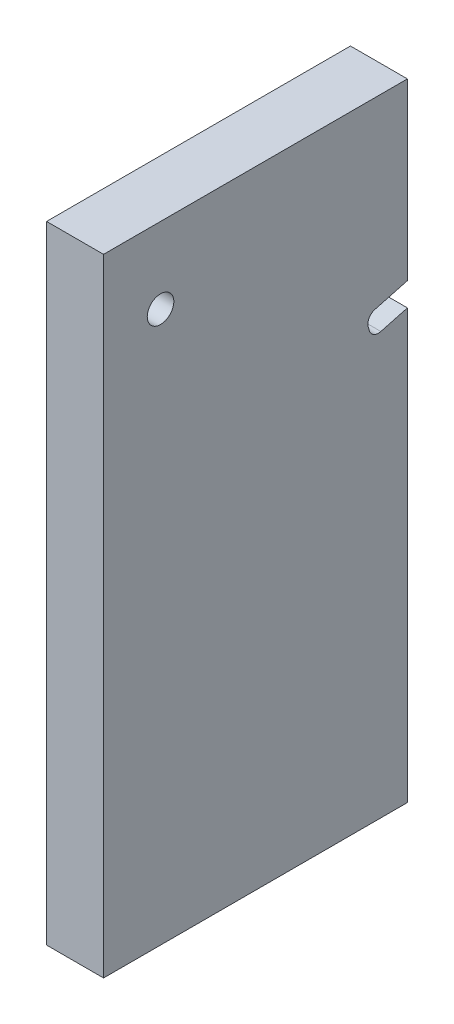
ISO-10303-21;
HEADER;
FILE_DESCRIPTION(('STEP AP214'),'2;1');
FILE_NAME('part.step','',(''),(''),'','','');
FILE_SCHEMA(('AUTOMOTIVE_DESIGN { 1 0 10303 214 1 1 1 1 }'));
ENDSEC;
DATA;
#1=APPLICATION_CONTEXT('core data for automotive mechanical design processes');
#2=APPLICATION_PROTOCOL_DEFINITION('international standard','automotive_design',2000,#1);
#3=PRODUCT_CONTEXT('',#1,'mechanical');
#4=PRODUCT('Part','Part','',(#3));
#5=PRODUCT_RELATED_PRODUCT_CATEGORY('part','',(#4));
#6=PRODUCT_DEFINITION_FORMATION('','',#4);
#7=PRODUCT_DEFINITION_CONTEXT('part definition',#1,'design');
#8=PRODUCT_DEFINITION('design','',#6,#7);
#9=PRODUCT_DEFINITION_SHAPE('','',#8);
#10=(LENGTH_UNIT() NAMED_UNIT(*) SI_UNIT(.MILLI.,.METRE.));
#11=(NAMED_UNIT(*) PLANE_ANGLE_UNIT() SI_UNIT($,.RADIAN.));
#12=(NAMED_UNIT(*) SI_UNIT($,.STERADIAN.) SOLID_ANGLE_UNIT());
#13=UNCERTAINTY_MEASURE_WITH_UNIT(LENGTH_MEASURE(1.E-05),#10,'distance_accuracy_value','');
#14=(GEOMETRIC_REPRESENTATION_CONTEXT(3) GLOBAL_UNCERTAINTY_ASSIGNED_CONTEXT((#13)) GLOBAL_UNIT_ASSIGNED_CONTEXT((#10,
#11,#12)) REPRESENTATION_CONTEXT('',''));
#15=CARTESIAN_POINT('',(0.,0.,0.));
#16=DIRECTION('',(0.,0.,1.));
#17=DIRECTION('',(1.,0.,0.));
#18=AXIS2_PLACEMENT_3D('',#15,#16,#17);
#19=CARTESIAN_POINT('',(34.99,112.670967303587,-604.941327015322));
#20=DIRECTION('',(0.,0.258819045102539,-0.965925826289063));
#21=DIRECTION('',(0.,0.965925826289063,0.258819045102539));
#22=AXIS2_PLACEMENT_3D('',#19,#20,#21);
#23=PLANE('',#22);
#24=DIRECTION('',(1.,0.,0.));
#25=VECTOR('',#24,1.);
#26=CARTESIAN_POINT('',(42.5,112.68062656185,-604.938738824871));
#27=LINE('',#26,#25);
#28=CARTESIAN_POINT('',(35.,112.68062656185,-604.938738824871));
#29=VERTEX_POINT('',#28);
#30=CARTESIAN_POINT('',(50.,112.68062656185,-604.938738824871));
#31=VERTEX_POINT('',#30);
#32=EDGE_CURVE('E146',#29,#31,#27,.T.);
#33=ORIENTED_EDGE('',*,*,#32,.F.);
#34=DIRECTION('',(0.,0.965925826289091,0.258819045102437));
#35=VECTOR('',#34,1.);
#36=CARTESIAN_POINT('',(35.,113.163589474994,-604.80932930232));
#37=LINE('',#36,#35);
#38=CARTESIAN_POINT('',(35.,113.646552388139,-604.679919779768));
#39=VERTEX_POINT('',#38);
#40=EDGE_CURVE('E149',#29,#39,#37,.T.);
#41=ORIENTED_EDGE('',*,*,#40,.T.);
#42=DIRECTION('',(-1.,0.,0.));
#43=VECTOR('',#42,1.);
#44=CARTESIAN_POINT('',(42.5,113.646552388139,-604.679919779768));
#45=LINE('',#44,#43);
#46=CARTESIAN_POINT('',(50.,113.646552388139,-604.679919779768));
#47=VERTEX_POINT('',#46);
#48=EDGE_CURVE('E81',#47,#39,#45,.T.);
#49=ORIENTED_EDGE('',*,*,#48,.F.);
#50=DIRECTION('',(0.,-0.965925826289063,-0.258819045102539));
#51=VECTOR('',#50,1.);
#52=CARTESIAN_POINT('',(50.,113.163589474994,-604.80932930232));
#53=LINE('',#52,#51);
#54=EDGE_CURVE('E72',#47,#31,#53,.T.);
#55=ORIENTED_EDGE('',*,*,#54,.T.);
#56=EDGE_LOOP('',(#33,#41,#49,#55));
#57=FACE_BOUND('',#56,.T.);
#58=ADVANCED_FACE('F17',(#57),#23,.T.);
#59=CARTESIAN_POINT('',(35.,113.327674174606,-607.353553390593));
#60=DIRECTION('',(1.,0.,0.));
#61=DIRECTION('',(0.,0.,-1.));
#62=AXIS2_PLACEMENT_3D('',#59,#60,#61);
#63=CYLINDRICAL_SURFACE('',#62,2.49999999999945);
#64=CARTESIAN_POINT('',(50.,113.327674174606,-607.353553390593));
#65=DIRECTION('',(1.,0.,0.));
#66=DIRECTION('',(0.,0.,-1.));
#67=AXIS2_PLACEMENT_3D('',#64,#65,#66);
#68=CIRCLE('',#67,2.49999999999945);
#69=CARTESIAN_POINT('',(50.,110.912859608883,-608.00060100335));
#70=VERTEX_POINT('',#69);
#71=EDGE_CURVE('E186',#70,#31,#68,.F.);
#72=ORIENTED_EDGE('',*,*,#71,.F.);
#73=DIRECTION('',(1.,0.,0.));
#74=VECTOR('',#73,1.);
#75=CARTESIAN_POINT('',(42.5,110.912859608883,-608.00060100335));
#76=LINE('',#75,#74);
#77=CARTESIAN_POINT('',(35.,110.912859608883,-608.00060100335));
#78=VERTEX_POINT('',#77);
#79=EDGE_CURVE('E144',#78,#70,#76,.T.);
#80=ORIENTED_EDGE('',*,*,#79,.F.);
#81=CARTESIAN_POINT('',(35.,113.327674174606,-607.353553390593));
#82=DIRECTION('',(1.,0.,0.));
#83=DIRECTION('',(0.,0.,-1.));
#84=AXIS2_PLACEMENT_3D('',#81,#82,#83);
#85=CIRCLE('',#84,2.49999999999945);
#86=EDGE_CURVE('E183',#29,#78,#85,.T.);
#87=ORIENTED_EDGE('',*,*,#86,.F.);
#88=ORIENTED_EDGE('',*,*,#32,.T.);
#89=EDGE_LOOP('',(#72,#80,#87,#88));
#90=FACE_BOUND('',#89,.T.);
#91=ADVANCED_FACE('F197',(#90),#63,.F.);
#92=CARTESIAN_POINT('',(34.99,112.79093110799,-615.009659258263));
#93=DIRECTION('',(0.,0.965925826289058,0.258819045102561));
#94=DIRECTION('',(0.,-0.258819045102561,0.965925826289058));
#95=AXIS2_PLACEMENT_3D('',#92,#93,#94);
#96=PLANE('',#95);
#97=DIRECTION('',(1.,0.,0.));
#98=VECTOR('',#97,1.);
#99=CARTESIAN_POINT('',(42.5,112.788342917539,-615.));
#100=LINE('',#99,#98);
#101=CARTESIAN_POINT('',(35.,112.788342917539,-615.));
#102=VERTEX_POINT('',#101);
#103=CARTESIAN_POINT('',(50.,112.788342917539,-615.));
#104=VERTEX_POINT('',#103);
#105=EDGE_CURVE('E135',#102,#104,#100,.T.);
#106=ORIENTED_EDGE('',*,*,#105,.F.);
#107=DIRECTION('',(0.,0.258819045102567,-0.965925826289056));
#108=VECTOR('',#107,1.);
#109=CARTESIAN_POINT('',(35.,110.912859608883,-608.00060100335));
#110=LINE('',#109,#108);
#111=EDGE_CURVE('E140',#78,#102,#110,.T.);
#112=ORIENTED_EDGE('',*,*,#111,.F.);
#113=ORIENTED_EDGE('',*,*,#79,.T.);
#114=DIRECTION('',(0.,-0.258819045102567,0.965925826289056));
#115=VECTOR('',#114,1.);
#116=CARTESIAN_POINT('',(50.,112.788342917539,-615.));
#117=LINE('',#116,#115);
#118=EDGE_CURVE('E153',#104,#70,#117,.T.);
#119=ORIENTED_EDGE('',*,*,#118,.F.);
#120=EDGE_LOOP('',(#106,#112,#113,#119));
#121=FACE_BOUND('',#120,.T.);
#122=ADVANCED_FACE('F192',(#121),#96,.T.);
#123=CARTESIAN_POINT('',(34.99,-0.0100000000000739,-615.));
#124=DIRECTION('',(0.,0.,-1.));
#125=DIRECTION('',(0.,1.,0.));
#126=AXIS2_PLACEMENT_3D('',#123,#124,#125);
#127=PLANE('',#126);
#128=DIRECTION('',(0.,1.,0.));
#129=VECTOR('',#128,1.);
#130=CARTESIAN_POINT('',(50.,82.5,-615.));
#131=LINE('',#130,#129);
#132=CARTESIAN_POINT('',(50.,0.,-615.));
#133=VERTEX_POINT('',#132);
#134=EDGE_CURVE('E150',#133,#104,#131,.T.);
#135=ORIENTED_EDGE('',*,*,#134,.F.);
#136=DIRECTION('',(1.,0.,0.));
#137=VECTOR('',#136,1.);
#138=CARTESIAN_POINT('',(42.5,0.,-615.));
#139=LINE('',#138,#137);
#140=CARTESIAN_POINT('',(35.,0.,-615.));
#141=VERTEX_POINT('',#140);
#142=EDGE_CURVE('E125',#141,#133,#139,.T.);
#143=ORIENTED_EDGE('',*,*,#142,.F.);
#144=DIRECTION('',(0.,-1.,0.));
#145=VECTOR('',#144,1.);
#146=CARTESIAN_POINT('',(35.,82.5,-615.));
#147=LINE('',#146,#145);
#148=EDGE_CURVE('E130',#102,#141,#147,.T.);
#149=ORIENTED_EDGE('',*,*,#148,.F.);
#150=ORIENTED_EDGE('',*,*,#105,.T.);
#151=EDGE_LOOP('',(#135,#143,#149,#150));
#152=FACE_BOUND('',#151,.T.);
#153=ADVANCED_FACE('F226',(#152),#127,.T.);
#154=CARTESIAN_POINT('',(34.99,0.,-534.99));
#155=DIRECTION('',(0.,-1.,0.));
#156=DIRECTION('',(0.,0.,-1.));
#157=AXIS2_PLACEMENT_3D('',#154,#155,#156);
#158=PLANE('',#157);
#159=DIRECTION('',(0.,0.,-1.));
#160=VECTOR('',#159,1.);
#161=CARTESIAN_POINT('',(50.,0.,-575.));
#162=LINE('',#161,#160);
#163=CARTESIAN_POINT('',(50.,0.,-535.));
#164=VERTEX_POINT('',#163);
#165=EDGE_CURVE('E154',#164,#133,#162,.T.);
#166=ORIENTED_EDGE('',*,*,#165,.F.);
#167=DIRECTION('',(1.,0.,0.));
#168=VECTOR('',#167,1.);
#169=CARTESIAN_POINT('',(42.5,0.,-535.));
#170=LINE('',#169,#168);
#171=CARTESIAN_POINT('',(35.,0.,-535.));
#172=VERTEX_POINT('',#171);
#173=EDGE_CURVE('E115',#172,#164,#170,.T.);
#174=ORIENTED_EDGE('',*,*,#173,.F.);
#175=DIRECTION('',(0.,0.,1.));
#176=VECTOR('',#175,1.);
#177=CARTESIAN_POINT('',(35.,0.,-575.));
#178=LINE('',#177,#176);
#179=EDGE_CURVE('E120',#141,#172,#178,.T.);
#180=ORIENTED_EDGE('',*,*,#179,.F.);
#181=ORIENTED_EDGE('',*,*,#142,.T.);
#182=EDGE_LOOP('',(#166,#174,#180,#181));
#183=FACE_BOUND('',#182,.T.);
#184=ADVANCED_FACE('F229',(#183),#158,.T.);
#185=CARTESIAN_POINT('',(34.99,165.01,-535.));
#186=DIRECTION('',(0.,0.,1.));
#187=DIRECTION('',(0.,-1.,0.));
#188=AXIS2_PLACEMENT_3D('',#185,#186,#187);
#189=PLANE('',#188);
#190=DIRECTION('',(0.,-1.,0.));
#191=VECTOR('',#190,1.);
#192=CARTESIAN_POINT('',(50.,82.5,-535.));
#193=LINE('',#192,#191);
#194=CARTESIAN_POINT('',(50.,165.,-535.));
#195=VERTEX_POINT('',#194);
#196=EDGE_CURVE('E159',#195,#164,#193,.T.);
#197=ORIENTED_EDGE('',*,*,#196,.F.);
#198=DIRECTION('',(1.,0.,0.));
#199=VECTOR('',#198,1.);
#200=CARTESIAN_POINT('',(42.5,165.,-535.));
#201=LINE('',#200,#199);
#202=CARTESIAN_POINT('',(35.,165.,-535.));
#203=VERTEX_POINT('',#202);
#204=EDGE_CURVE('E105',#203,#195,#201,.T.);
#205=ORIENTED_EDGE('',*,*,#204,.F.);
#206=DIRECTION('',(0.,1.,0.));
#207=VECTOR('',#206,1.);
#208=CARTESIAN_POINT('',(35.,82.5,-535.));
#209=LINE('',#208,#207);
#210=EDGE_CURVE('E110',#172,#203,#209,.T.);
#211=ORIENTED_EDGE('',*,*,#210,.F.);
#212=ORIENTED_EDGE('',*,*,#173,.T.);
#213=EDGE_LOOP('',(#197,#205,#211,#212));
#214=FACE_BOUND('',#213,.T.);
#215=ADVANCED_FACE('F233',(#214),#189,.T.);
#216=CARTESIAN_POINT('',(34.99,165.,-615.01));
#217=DIRECTION('',(0.,1.,0.));
#218=DIRECTION('',(0.,0.,1.));
#219=AXIS2_PLACEMENT_3D('',#216,#217,#218);
#220=PLANE('',#219);
#221=DIRECTION('',(0.,0.,1.));
#222=VECTOR('',#221,1.);
#223=CARTESIAN_POINT('',(50.,165.,-575.));
#224=LINE('',#223,#222);
#225=CARTESIAN_POINT('',(50.,165.,-615.));
#226=VERTEX_POINT('',#225);
#227=EDGE_CURVE('E164',#226,#195,#224,.T.);
#228=ORIENTED_EDGE('',*,*,#227,.F.);
#229=DIRECTION('',(1.,0.,0.));
#230=VECTOR('',#229,1.);
#231=CARTESIAN_POINT('',(42.5,165.,-615.));
#232=LINE('',#231,#230);
#233=CARTESIAN_POINT('',(35.,165.,-615.));
#234=VERTEX_POINT('',#233);
#235=EDGE_CURVE('E95',#234,#226,#232,.T.);
#236=ORIENTED_EDGE('',*,*,#235,.F.);
#237=DIRECTION('',(0.,0.,-1.));
#238=VECTOR('',#237,1.);
#239=CARTESIAN_POINT('',(35.,165.,-575.));
#240=LINE('',#239,#238);
#241=EDGE_CURVE('E100',#203,#234,#240,.T.);
#242=ORIENTED_EDGE('',*,*,#241,.F.);
#243=ORIENTED_EDGE('',*,*,#204,.T.);
#244=EDGE_LOOP('',(#228,#236,#242,#243));
#245=FACE_BOUND('',#244,.T.);
#246=ADVANCED_FACE('F234',(#245),#220,.T.);
#247=CARTESIAN_POINT('',(34.99,118.99,-615.));
#248=DIRECTION('',(0.,0.,-1.));
#249=DIRECTION('',(0.,1.,0.));
#250=AXIS2_PLACEMENT_3D('',#247,#248,#249);
#251=PLANE('',#250);
#252=DIRECTION('',(0.,1.,0.));
#253=VECTOR('',#252,1.);
#254=CARTESIAN_POINT('',(50.,82.5,-615.));
#255=LINE('',#254,#253);
#256=CARTESIAN_POINT('',(50.,119.,-615.));
#257=VERTEX_POINT('',#256);
#258=EDGE_CURVE('E89',#257,#226,#255,.T.);
#259=ORIENTED_EDGE('',*,*,#258,.F.);
#260=DIRECTION('',(1.,0.,0.));
#261=VECTOR('',#260,1.);
#262=CARTESIAN_POINT('',(42.5,119.,-615.));
#263=LINE('',#262,#261);
#264=CARTESIAN_POINT('',(35.,119.,-615.));
#265=VERTEX_POINT('',#264);
#266=EDGE_CURVE('E82',#265,#257,#263,.T.);
#267=ORIENTED_EDGE('',*,*,#266,.F.);
#268=DIRECTION('',(0.,-1.,0.));
#269=VECTOR('',#268,1.);
#270=CARTESIAN_POINT('',(35.,82.5,-615.));
#271=LINE('',#270,#269);
#272=EDGE_CURVE('E96',#234,#265,#271,.T.);
#273=ORIENTED_EDGE('',*,*,#272,.F.);
#274=ORIENTED_EDGE('',*,*,#235,.T.);
#275=EDGE_LOOP('',(#259,#267,#273,#274));
#276=FACE_BOUND('',#275,.T.);
#277=ADVANCED_FACE('F205',(#276),#251,.T.);
#278=CARTESIAN_POINT('',(34.99,116.705826376167,-606.438027474471));
#279=DIRECTION('',(0.,-0.96592582628907,-0.258819045102515));
#280=DIRECTION('',(0.,0.258819045102515,-0.96592582628907));
#281=AXIS2_PLACEMENT_3D('',#278,#279,#280);
#282=PLANE('',#281);
#283=ORIENTED_EDGE('',*,*,#266,.T.);
#284=DIRECTION('',(0.,0.258819045102528,-0.965925826289066));
#285=VECTOR('',#284,1.);
#286=CARTESIAN_POINT('',(50.,116.708414566618,-606.447686732734));
#287=LINE('',#286,#285);
#288=CARTESIAN_POINT('',(50.,116.708414566618,-606.447686732734));
#289=VERTEX_POINT('',#288);
#290=EDGE_CURVE('E85',#289,#257,#287,.T.);
#291=ORIENTED_EDGE('',*,*,#290,.F.);
#292=DIRECTION('',(1.,0.,0.));
#293=VECTOR('',#292,1.);
#294=CARTESIAN_POINT('',(42.5,116.708414566618,-606.447686732734));
#295=LINE('',#294,#293);
#296=CARTESIAN_POINT('',(35.,116.708414566618,-606.447686732734));
#297=VERTEX_POINT('',#296);
#298=EDGE_CURVE('E36',#297,#289,#295,.T.);
#299=ORIENTED_EDGE('',*,*,#298,.F.);
#300=DIRECTION('',(0.,-0.258819045102528,0.965925826289066));
#301=VECTOR('',#300,1.);
#302=CARTESIAN_POINT('',(35.,119.,-615.));
#303=LINE('',#302,#301);
#304=EDGE_CURVE('E99',#265,#297,#303,.T.);
#305=ORIENTED_EDGE('',*,*,#304,.F.);
#306=EDGE_LOOP('',(#283,#291,#299,#305));
#307=FACE_BOUND('',#306,.T.);
#308=ADVANCED_FACE('F86',(#307),#282,.T.);
#309=CARTESIAN_POINT('',(35.,114.293600000895,-607.09473434549));
#310=DIRECTION('',(1.,0.,0.));
#311=DIRECTION('',(0.,0.,-1.));
#312=AXIS2_PLACEMENT_3D('',#309,#310,#311);
#313=CYLINDRICAL_SURFACE('',#312,2.49999999999991);
#314=CARTESIAN_POINT('',(50.,114.293600000895,-607.09473434549));
#315=DIRECTION('',(1.,0.,0.));
#316=DIRECTION('',(0.,0.,-1.));
#317=AXIS2_PLACEMENT_3D('',#314,#315,#316);
#318=CIRCLE('',#317,2.49999999999991);
#319=EDGE_CURVE('E21',#47,#289,#318,.F.);
#320=ORIENTED_EDGE('',*,*,#319,.F.);
#321=ORIENTED_EDGE('',*,*,#48,.T.);
#322=CARTESIAN_POINT('',(35.,114.293600000895,-607.09473434549));
#323=DIRECTION('',(1.,0.,0.));
#324=DIRECTION('',(0.,0.,-1.));
#325=AXIS2_PLACEMENT_3D('',#322,#323,#324);
#326=CIRCLE('',#325,2.49999999999991);
#327=EDGE_CURVE('E79',#297,#39,#326,.T.);
#328=ORIENTED_EDGE('',*,*,#327,.F.);
#329=ORIENTED_EDGE('',*,*,#298,.T.);
#330=EDGE_LOOP('',(#320,#321,#328,#329));
#331=FACE_BOUND('',#330,.T.);
#332=ADVANCED_FACE('F76',(#331),#313,.F.);
#333=CARTESIAN_POINT('',(50.,-0.0100000000000655,-534.99));
#334=DIRECTION('',(1.,0.,0.));
#335=DIRECTION('',(0.,0.,-1.));
#336=AXIS2_PLACEMENT_3D('',#333,#334,#335);
#337=PLANE('',#336);
#338=CARTESIAN_POINT('',(50.,145.,-550.));
#339=DIRECTION('',(-1.,0.,0.));
#340=DIRECTION('',(0.,0.,1.));
#341=AXIS2_PLACEMENT_3D('',#338,#339,#340);
#342=CIRCLE('',#341,3.50000000000001);
#343=CARTESIAN_POINT('',(50.,145.,-546.5));
#344=VERTEX_POINT('',#343);
#345=EDGE_CURVE('E27',#344,#344,#342,.F.);
#346=ORIENTED_EDGE('',*,*,#345,.F.);
#347=EDGE_LOOP('',(#346));
#348=FACE_BOUND('',#347,.T.);
#349=ORIENTED_EDGE('',*,*,#118,.T.);
#350=ORIENTED_EDGE('',*,*,#71,.T.);
#351=ORIENTED_EDGE('',*,*,#54,.F.);
#352=ORIENTED_EDGE('',*,*,#319,.T.);
#353=ORIENTED_EDGE('',*,*,#290,.T.);
#354=ORIENTED_EDGE('',*,*,#258,.T.);
#355=ORIENTED_EDGE('',*,*,#227,.T.);
#356=ORIENTED_EDGE('',*,*,#196,.T.);
#357=ORIENTED_EDGE('',*,*,#165,.T.);
#358=ORIENTED_EDGE('',*,*,#134,.T.);
#359=EDGE_LOOP('',(#349,#350,#351,#352,#353,#354,#355,#356,#357,#358));
#360=FACE_BOUND('',#359,.T.);
#361=ADVANCED_FACE('F91',(#348,#360),#337,.T.);
#362=CARTESIAN_POINT('',(35.,-0.0100000000000655,-615.01));
#363=DIRECTION('',(-1.,0.,0.));
#364=DIRECTION('',(0.,0.,1.));
#365=AXIS2_PLACEMENT_3D('',#362,#363,#364);
#366=PLANE('',#365);
#367=CARTESIAN_POINT('',(35.,145.,-550.));
#368=DIRECTION('',(-1.,0.,0.));
#369=DIRECTION('',(0.,0.,1.));
#370=AXIS2_PLACEMENT_3D('',#367,#368,#369);
#371=CIRCLE('',#370,3.50000000000001);
#372=CARTESIAN_POINT('',(35.,145.,-546.5));
#373=VERTEX_POINT('',#372);
#374=EDGE_CURVE('E11',#373,#373,#371,.T.);
#375=ORIENTED_EDGE('',*,*,#374,.F.);
#376=EDGE_LOOP('',(#375));
#377=FACE_BOUND('',#376,.T.);
#378=ORIENTED_EDGE('',*,*,#304,.T.);
#379=ORIENTED_EDGE('',*,*,#327,.T.);
#380=ORIENTED_EDGE('',*,*,#40,.F.);
#381=ORIENTED_EDGE('',*,*,#86,.T.);
#382=ORIENTED_EDGE('',*,*,#111,.T.);
#383=ORIENTED_EDGE('',*,*,#148,.T.);
#384=ORIENTED_EDGE('',*,*,#179,.T.);
#385=ORIENTED_EDGE('',*,*,#210,.T.);
#386=ORIENTED_EDGE('',*,*,#241,.T.);
#387=ORIENTED_EDGE('',*,*,#272,.T.);
#388=EDGE_LOOP('',(#378,#379,#380,#381,#382,#383,#384,#385,#386,#387));
#389=FACE_BOUND('',#388,.T.);
#390=ADVANCED_FACE('F201',(#377,#389),#366,.T.);
#391=CARTESIAN_POINT('',(50.,145.,-550.));
#392=DIRECTION('',(-1.,0.,0.));
#393=DIRECTION('',(0.,0.,1.));
#394=AXIS2_PLACEMENT_3D('',#391,#392,#393);
#395=CYLINDRICAL_SURFACE('',#394,3.50000000000001);
#396=ORIENTED_EDGE('',*,*,#374,.T.);
#397=EDGE_LOOP('',(#396));
#398=FACE_BOUND('',#397,.T.);
#399=ORIENTED_EDGE('',*,*,#345,.T.);
#400=EDGE_LOOP('',(#399));
#401=FACE_BOUND('',#400,.T.);
#402=ADVANCED_FACE('F19',(#398,#401),#395,.F.);
#403=CLOSED_SHELL('',(#58,#91,#122,#153,#184,#215,#246,#277,#308,#332,#361,#390,#402));
#404=MANIFOLD_SOLID_BREP('B1',#403);
#405=ADVANCED_BREP_SHAPE_REPRESENTATION('',(#18,#404),#14);
#406=SHAPE_DEFINITION_REPRESENTATION(#9,#405);
ENDSEC;
END-ISO-10303-21;
